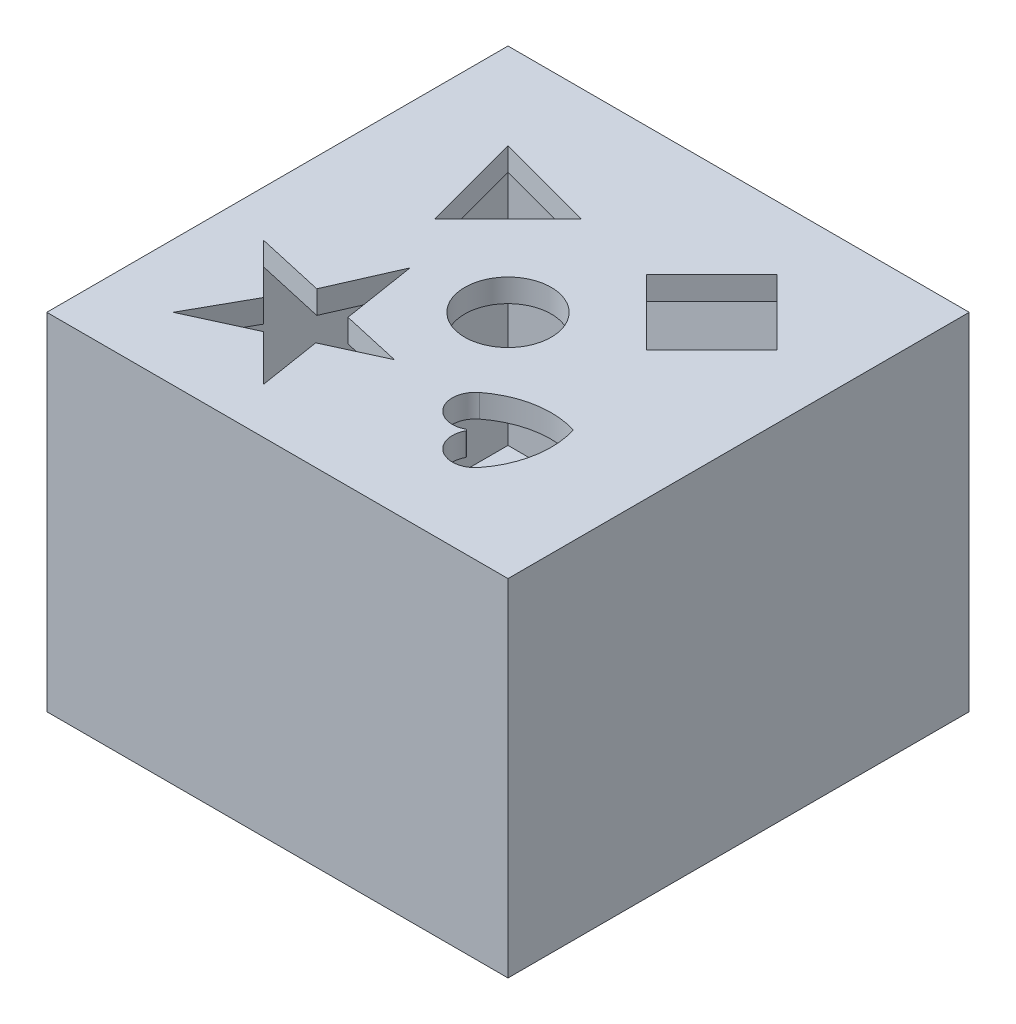
ISO-10303-21;
HEADER;
FILE_DESCRIPTION(('STEP AP214'),'2;1');
FILE_NAME('part.step','',(''),(''),'','','');
FILE_SCHEMA(('AUTOMOTIVE_DESIGN { 1 0 10303 214 1 1 1 1 }'));
ENDSEC;
DATA;
#1=APPLICATION_CONTEXT('core data for automotive mechanical design processes');
#2=APPLICATION_PROTOCOL_DEFINITION('international standard','automotive_design',2000,#1);
#3=PRODUCT_CONTEXT('',#1,'mechanical');
#4=PRODUCT('Part','Part','',(#3));
#5=PRODUCT_RELATED_PRODUCT_CATEGORY('part','',(#4));
#6=PRODUCT_DEFINITION_FORMATION('','',#4);
#7=PRODUCT_DEFINITION_CONTEXT('part definition',#1,'design');
#8=PRODUCT_DEFINITION('design','',#6,#7);
#9=PRODUCT_DEFINITION_SHAPE('','',#8);
#10=(LENGTH_UNIT() NAMED_UNIT(*) SI_UNIT(.MILLI.,.METRE.));
#11=(NAMED_UNIT(*) PLANE_ANGLE_UNIT() SI_UNIT($,.RADIAN.));
#12=(NAMED_UNIT(*) SI_UNIT($,.STERADIAN.) SOLID_ANGLE_UNIT());
#13=UNCERTAINTY_MEASURE_WITH_UNIT(LENGTH_MEASURE(1.E-05),#10,'distance_accuracy_value','');
#14=(GEOMETRIC_REPRESENTATION_CONTEXT(3) GLOBAL_UNCERTAINTY_ASSIGNED_CONTEXT((#13)) GLOBAL_UNIT_ASSIGNED_CONTEXT((#10,
#11,#12)) REPRESENTATION_CONTEXT('',''));
#15=CARTESIAN_POINT('',(0.,0.,0.));
#16=DIRECTION('',(0.,0.,1.));
#17=DIRECTION('',(1.,0.,0.));
#18=AXIS2_PLACEMENT_3D('',#15,#16,#17);
#19=CARTESIAN_POINT('',(20.,15.,-20.));
#20=DIRECTION('',(-1.,0.,0.));
#21=DIRECTION('',(0.,0.,1.));
#22=AXIS2_PLACEMENT_3D('',#19,#20,#21);
#23=PLANE('',#22);
#24=DIRECTION('',(0.,0.,-1.));
#25=VECTOR('',#24,1.);
#26=CARTESIAN_POINT('',(20.,-15.,-20.));
#27=LINE('',#26,#25);
#28=CARTESIAN_POINT('',(20.,-15.,20.));
#29=VERTEX_POINT('',#28);
#30=CARTESIAN_POINT('',(20.,-15.,-20.));
#31=VERTEX_POINT('',#30);
#32=EDGE_CURVE('E437',#29,#31,#27,.T.);
#33=ORIENTED_EDGE('',*,*,#32,.T.);
#34=DIRECTION('',(0.,-1.,0.));
#35=VECTOR('',#34,1.);
#36=CARTESIAN_POINT('',(20.,15.,-20.));
#37=LINE('',#36,#35);
#38=CARTESIAN_POINT('',(20.,15.,-20.));
#39=VERTEX_POINT('',#38);
#40=EDGE_CURVE('E469',#39,#31,#37,.T.);
#41=ORIENTED_EDGE('',*,*,#40,.F.);
#42=DIRECTION('',(0.,0.,-1.));
#43=VECTOR('',#42,1.);
#44=CARTESIAN_POINT('',(20.,15.,-20.));
#45=LINE('',#44,#43);
#46=CARTESIAN_POINT('',(20.,15.,20.));
#47=VERTEX_POINT('',#46);
#48=EDGE_CURVE('E443',#47,#39,#45,.T.);
#49=ORIENTED_EDGE('',*,*,#48,.F.);
#50=DIRECTION('',(0.,-1.,0.));
#51=VECTOR('',#50,1.);
#52=CARTESIAN_POINT('',(20.,15.,20.));
#53=LINE('',#52,#51);
#54=EDGE_CURVE('E453',#47,#29,#53,.T.);
#55=ORIENTED_EDGE('',*,*,#54,.T.);
#56=EDGE_LOOP('',(#33,#41,#49,#55));
#57=FACE_BOUND('',#56,.T.);
#58=ADVANCED_FACE('F33',(#57),#23,.F.);
#59=CARTESIAN_POINT('',(-20.,15.,-20.));
#60=DIRECTION('',(0.,0.,1.));
#61=DIRECTION('',(1.,0.,0.));
#62=AXIS2_PLACEMENT_3D('',#59,#60,#61);
#63=PLANE('',#62);
#64=DIRECTION('',(-1.,0.,0.));
#65=VECTOR('',#64,1.);
#66=CARTESIAN_POINT('',(-20.,-15.,-20.));
#67=LINE('',#66,#65);
#68=CARTESIAN_POINT('',(-20.,-15.,-20.));
#69=VERTEX_POINT('',#68);
#70=EDGE_CURVE('E456',#31,#69,#67,.T.);
#71=ORIENTED_EDGE('',*,*,#70,.T.);
#72=DIRECTION('',(0.,-1.,0.));
#73=VECTOR('',#72,1.);
#74=CARTESIAN_POINT('',(-20.,15.,-20.));
#75=LINE('',#74,#73);
#76=CARTESIAN_POINT('',(-20.,15.,-20.));
#77=VERTEX_POINT('',#76);
#78=EDGE_CURVE('E466',#77,#69,#75,.T.);
#79=ORIENTED_EDGE('',*,*,#78,.F.);
#80=DIRECTION('',(-1.,0.,0.));
#81=VECTOR('',#80,1.);
#82=CARTESIAN_POINT('',(-20.,15.,-20.));
#83=LINE('',#82,#81);
#84=EDGE_CURVE('E446',#39,#77,#83,.T.);
#85=ORIENTED_EDGE('',*,*,#84,.F.);
#86=ORIENTED_EDGE('',*,*,#40,.T.);
#87=EDGE_LOOP('',(#71,#79,#85,#86));
#88=FACE_BOUND('',#87,.T.);
#89=ADVANCED_FACE('F500',(#88),#63,.F.);
#90=CARTESIAN_POINT('',(-20.,15.,-20.));
#91=DIRECTION('',(1.,0.,0.));
#92=DIRECTION('',(0.,0.,-1.));
#93=AXIS2_PLACEMENT_3D('',#90,#91,#92);
#94=PLANE('',#93);
#95=DIRECTION('',(0.,0.,1.));
#96=VECTOR('',#95,1.);
#97=CARTESIAN_POINT('',(-20.,-15.,-20.));
#98=LINE('',#97,#96);
#99=CARTESIAN_POINT('',(-20.,-15.,20.));
#100=VERTEX_POINT('',#99);
#101=EDGE_CURVE('E458',#69,#100,#98,.T.);
#102=ORIENTED_EDGE('',*,*,#101,.T.);
#103=DIRECTION('',(0.,-1.,0.));
#104=VECTOR('',#103,1.);
#105=CARTESIAN_POINT('',(-20.,15.,20.));
#106=LINE('',#105,#104);
#107=CARTESIAN_POINT('',(-20.,15.,20.));
#108=VERTEX_POINT('',#107);
#109=EDGE_CURVE('E463',#108,#100,#106,.T.);
#110=ORIENTED_EDGE('',*,*,#109,.F.);
#111=DIRECTION('',(0.,0.,1.));
#112=VECTOR('',#111,1.);
#113=CARTESIAN_POINT('',(-20.,15.,-20.));
#114=LINE('',#113,#112);
#115=EDGE_CURVE('E449',#77,#108,#114,.T.);
#116=ORIENTED_EDGE('',*,*,#115,.F.);
#117=ORIENTED_EDGE('',*,*,#78,.T.);
#118=EDGE_LOOP('',(#102,#110,#116,#117));
#119=FACE_BOUND('',#118,.T.);
#120=ADVANCED_FACE('F505',(#119),#94,.F.);
#121=CARTESIAN_POINT('',(-20.,15.,20.));
#122=DIRECTION('',(0.,0.,-1.));
#123=DIRECTION('',(-1.,0.,0.));
#124=AXIS2_PLACEMENT_3D('',#121,#122,#123);
#125=PLANE('',#124);
#126=DIRECTION('',(1.,0.,0.));
#127=VECTOR('',#126,1.);
#128=CARTESIAN_POINT('',(-20.,-15.,20.));
#129=LINE('',#128,#127);
#130=EDGE_CURVE('E447',#100,#29,#129,.T.);
#131=ORIENTED_EDGE('',*,*,#130,.T.);
#132=ORIENTED_EDGE('',*,*,#54,.F.);
#133=DIRECTION('',(1.,0.,0.));
#134=VECTOR('',#133,1.);
#135=CARTESIAN_POINT('',(-20.,15.,20.));
#136=LINE('',#135,#134);
#137=EDGE_CURVE('E451',#108,#47,#136,.T.);
#138=ORIENTED_EDGE('',*,*,#137,.F.);
#139=ORIENTED_EDGE('',*,*,#109,.T.);
#140=EDGE_LOOP('',(#131,#132,#138,#139));
#141=FACE_BOUND('',#140,.T.);
#142=ADVANCED_FACE('F511',(#141),#125,.F.);
#143=CARTESIAN_POINT('',(0.,15.,0.));
#144=DIRECTION('',(0.,1.,0.));
#145=DIRECTION('',(0.,0.,1.));
#146=AXIS2_PLACEMENT_3D('',#143,#144,#145);
#147=PLANE('',#146);
#148=CARTESIAN_POINT('',(8.83883476483185,15.,11.667261889578));
#149=DIRECTION('',(0.,1.,0.));
#150=DIRECTION('',(0.,0.,1.));
#151=AXIS2_PLACEMENT_3D('',#148,#149,#150);
#152=CIRCLE('',#151,2.);
#153=CARTESIAN_POINT('',(7.06075588932713,15.,10.7516006462769));
#154=VERTEX_POINT('',#153);
#155=CARTESIAN_POINT('',(10.4111034100799,15.,12.9033732547753));
#156=VERTEX_POINT('',#155);
#157=EDGE_CURVE('E395',#154,#156,#152,.T.);
#158=ORIENTED_EDGE('',*,*,#157,.F.);
#159=CARTESIAN_POINT('',(6.97185194555189,15.,10.7058175841118));
#160=DIRECTION('',(0.,1.,0.));
#161=DIRECTION('',(0.,0.,1.));
#162=AXIS2_PLACEMENT_3D('',#159,#160,#161);
#163=CIRCLE('',#162,0.1);
#164=CARTESIAN_POINT('',(6.92606888338683,15.,10.6169136403366));
#165=VERTEX_POINT('',#164);
#166=EDGE_CURVE('E55',#154,#165,#163,.T.);
#167=ORIENTED_EDGE('',*,*,#166,.T.);
#168=CARTESIAN_POINT('',(6.01040764008565,15.,8.83883476483185));
#169=DIRECTION('',(0.,1.,0.));
#170=DIRECTION('',(0.,0.,1.));
#171=AXIS2_PLACEMENT_3D('',#168,#169,#170);
#172=CIRCLE('',#171,2.);
#173=CARTESIAN_POINT('',(4.77429627488837,15.,7.2665661195838));
#174=VERTEX_POINT('',#173);
#175=EDGE_CURVE('E393',#174,#165,#172,.T.);
#176=ORIENTED_EDGE('',*,*,#175,.F.);
#177=CARTESIAN_POINT('',(9.40971389437817,15.,13.162573539264));
#178=DIRECTION('',(0.,1.,0.));
#179=DIRECTION('',(0.,0.,-1.));
#180=AXIS2_PLACEMENT_3D('',#177,#178,#179);
#181=CIRCLE('',#180,7.50000000000002);
#182=CARTESIAN_POINT('',(11.667261889578,15.,6.01040764008563));
#183=VERTEX_POINT('',#182);
#184=EDGE_CURVE('E391',#183,#174,#181,.T.);
#185=ORIENTED_EDGE('',*,*,#184,.F.);
#186=CARTESIAN_POINT('',(4.51509599039972,15.,8.26795563528551));
#187=DIRECTION('',(0.,1.,0.));
#188=DIRECTION('',(0.,0.,1.));
#189=AXIS2_PLACEMENT_3D('',#186,#187,#188);
#190=CIRCLE('',#189,7.49999999999999);
#191=EDGE_CURVE('E383',#156,#183,#190,.T.);
#192=ORIENTED_EDGE('',*,*,#191,.F.);
#193=EDGE_LOOP('',(#158,#167,#176,#185,#192));
#194=FACE_BOUND('',#193,.T.);
#195=DIRECTION('',(-0.402746029819922,0.,0.915311769543192));
#196=VECTOR('',#195,1.);
#197=CARTESIAN_POINT('',(-10.0568797876879,15.,6.52797896050916));
#198=LINE('',#197,#196);
#199=CARTESIAN_POINT('',(-7.58197115154362,15.,0.903310222694767));
#200=VERTEX_POINT('',#199);
#201=CARTESIAN_POINT('',(-10.0568797876879,15.,6.52797896050916));
#202=VERTEX_POINT('',#201);
#203=EDGE_CURVE('E331',#200,#202,#198,.T.);
#204=ORIENTED_EDGE('',*,*,#203,.F.);
#205=DIRECTION('',(-0.156434465040204,0.,-0.987688340595142));
#206=VECTOR('',#205,1.);
#207=CARTESIAN_POINT('',(-7.58197115154362,15.,0.903310222694767));
#208=LINE('',#207,#206);
#209=CARTESIAN_POINT('',(-6.56672994665904,15.,7.31329091779646));
#210=VERTEX_POINT('',#209);
#211=EDGE_CURVE('E303',#210,#200,#208,.T.);
#212=ORIENTED_EDGE('',*,*,#211,.F.);
#213=DIRECTION('',(-0.975608065324912,0.,-0.219519709531931));
#214=VECTOR('',#213,1.);
#215=CARTESIAN_POINT('',(-6.56672994665904,15.,7.31329091779646));
#216=LINE('',#215,#214);
#217=CARTESIAN_POINT('',(-1.36300417246353,15.,8.48417132667744));
#218=VERTEX_POINT('',#217);
#219=EDGE_CURVE('E355',#218,#210,#216,.T.);
#220=ORIENTED_EDGE('',*,*,#219,.F.);
#221=DIRECTION('',(0.908919225140274,0.,-0.416972231893689));
#222=VECTOR('',#221,1.);
#223=CARTESIAN_POINT('',(-1.36300417246353,15.,8.48417132667744));
#224=LINE('',#223,#222);
#225=CARTESIAN_POINT('',(-6.04135271318949,15.,10.6303922213912));
#226=VERTEX_POINT('',#225);
#227=EDGE_CURVE('E352',#226,#218,#224,.T.);
#228=ORIENTED_EDGE('',*,*,#227,.F.);
#229=DIRECTION('',(-0.156434465040204,0.,-0.987688340595142));
#230=VECTOR('',#229,1.);
#231=CARTESIAN_POINT('',(-6.04135271318949,15.,10.6303922213912));
#232=LINE('',#231,#230);
#233=CARTESIAN_POINT('',(-5.19127449252038,15.,15.9975748747341));
#234=VERTEX_POINT('',#233);
#235=EDGE_CURVE('E349',#234,#226,#232,.T.);
#236=ORIENTED_EDGE('',*,*,#235,.F.);
#237=DIRECTION('',(0.707106781186528,0.,0.707106781186568));
#238=VECTOR('',#237,1.);
#239=CARTESIAN_POINT('',(-5.19127449252038,15.,15.9975748747341));
#240=LINE('',#239,#238);
#241=CARTESIAN_POINT('',(-9.13789808954164,15.,12.0509512777126));
#242=VERTEX_POINT('',#241);
#243=EDGE_CURVE('E346',#242,#234,#240,.T.);
#244=ORIENTED_EDGE('',*,*,#243,.F.);
#245=DIRECTION('',(0.908919225140274,0.,-0.416972231893689));
#246=VECTOR('',#245,1.);
#247=CARTESIAN_POINT('',(-9.13789808954164,15.,12.0509512777126));
#248=LINE('',#247,#246);
#249=CARTESIAN_POINT('',(-14.5200430826667,15.,14.5200430826664));
#250=VERTEX_POINT('',#249);
#251=EDGE_CURVE('E343',#250,#242,#248,.T.);
#252=ORIENTED_EDGE('',*,*,#251,.F.);
#253=DIRECTION('',(-0.487572413890718,0.,0.873082551201648));
#254=VECTOR('',#253,1.);
#255=CARTESIAN_POINT('',(-14.5200430826667,15.,14.5200430826664));
#256=LINE('',#255,#254);
#257=CARTESIAN_POINT('',(-11.7066579292842,15.,9.48219143796986));
#258=VERTEX_POINT('',#257);
#259=EDGE_CURVE('E340',#258,#250,#256,.T.);
#260=ORIENTED_EDGE('',*,*,#259,.F.);
#261=DIRECTION('',(0.707106781186529,0.,0.707106781186566));
#262=VECTOR('',#261,1.);
#263=CARTESIAN_POINT('',(-11.7066579292842,15.,9.48219143796986));
#264=LINE('',#263,#262);
#265=CARTESIAN_POINT('',(-15.9975748747339,15.,5.19127449251998));
#266=VERTEX_POINT('',#265);
#267=EDGE_CURVE('E337',#266,#258,#264,.T.);
#268=ORIENTED_EDGE('',*,*,#267,.F.);
#269=DIRECTION('',(-0.975608065324911,0.,-0.219519709531931));
#270=VECTOR('',#269,1.);
#271=CARTESIAN_POINT('',(-15.9975748747339,15.,5.19127449251998));
#272=LINE('',#271,#270);
#273=EDGE_CURVE('E333',#202,#266,#272,.T.);
#274=ORIENTED_EDGE('',*,*,#273,.F.);
#275=EDGE_LOOP('',(#204,#212,#220,#228,#236,#244,#252,#260,#268,#274));
#276=FACE_BOUND('',#275,.T.);
#277=DIRECTION('',(-0.965925826289065,0.,-0.258819045102533));
#278=VECTOR('',#277,1.);
#279=CARTESIAN_POINT('',(-3.81973694240498,15.,-10.1836979730839));
#280=LINE('',#279,#278);
#281=CARTESIAN_POINT('',(-3.81973694240498,15.,-10.1836979730839));
#282=VERTEX_POINT('',#281);
#283=CARTESIAN_POINT('',(-12.5130693790066,15.,-12.5130693790066));
#284=VERTEX_POINT('',#283);
#285=EDGE_CURVE('E286',#282,#284,#280,.T.);
#286=ORIENTED_EDGE('',*,*,#285,.F.);
#287=DIRECTION('',(0.707106781186557,0.,-0.707106781186539));
#288=VECTOR('',#287,1.);
#289=CARTESIAN_POINT('',(-10.183697973084,15.,-3.819736942405));
#290=LINE('',#289,#288);
#291=CARTESIAN_POINT('',(-10.183697973084,15.,-3.819736942405));
#292=VERTEX_POINT('',#291);
#293=EDGE_CURVE('E279',#292,#282,#290,.T.);
#294=ORIENTED_EDGE('',*,*,#293,.F.);
#295=DIRECTION('',(0.258819045102508,0.,0.965925826289072));
#296=VECTOR('',#295,1.);
#297=CARTESIAN_POINT('',(-12.5130693790066,15.,-12.5130693790066));
#298=LINE('',#297,#296);
#299=EDGE_CURVE('E288',#284,#292,#298,.T.);
#300=ORIENTED_EDGE('',*,*,#299,.F.);
#301=EDGE_LOOP('',(#286,#294,#300));
#302=FACE_BOUND('',#301,.T.);
#303=DIRECTION('',(0.707106781186547,0.,-0.707106781186548));
#304=VECTOR('',#303,1.);
#305=CARTESIAN_POINT('',(8.83883476483184,15.,-3.18198051533946));
#306=LINE('',#305,#304);
#307=CARTESIAN_POINT('',(8.83883476483184,15.,-3.18198051533946));
#308=VERTEX_POINT('',#307);
#309=CARTESIAN_POINT('',(14.4956890143242,15.,-8.83883476483184));
#310=VERTEX_POINT('',#309);
#311=EDGE_CURVE('E237',#308,#310,#306,.T.);
#312=ORIENTED_EDGE('',*,*,#311,.F.);
#313=DIRECTION('',(0.707106781186548,0.,0.707106781186548));
#314=VECTOR('',#313,1.);
#315=CARTESIAN_POINT('',(3.18198051533946,15.,-8.83883476483184));
#316=LINE('',#315,#314);
#317=CARTESIAN_POINT('',(3.18198051533946,15.,-8.83883476483184));
#318=VERTEX_POINT('',#317);
#319=EDGE_CURVE('E255',#318,#308,#316,.T.);
#320=ORIENTED_EDGE('',*,*,#319,.F.);
#321=DIRECTION('',(-0.707106781186547,0.,0.707106781186548));
#322=VECTOR('',#321,1.);
#323=CARTESIAN_POINT('',(8.83883476483184,15.,-14.4956890143242));
#324=LINE('',#323,#322);
#325=CARTESIAN_POINT('',(8.83883476483184,15.,-14.4956890143242));
#326=VERTEX_POINT('',#325);
#327=EDGE_CURVE('E258',#326,#318,#324,.T.);
#328=ORIENTED_EDGE('',*,*,#327,.F.);
#329=DIRECTION('',(-0.707106781186548,0.,-0.707106781186547));
#330=VECTOR('',#329,1.);
#331=CARTESIAN_POINT('',(14.4956890143242,15.,-8.83883476483184));
#332=LINE('',#331,#330);
#333=EDGE_CURVE('E264',#310,#326,#332,.T.);
#334=ORIENTED_EDGE('',*,*,#333,.F.);
#335=EDGE_LOOP('',(#312,#320,#328,#334));
#336=FACE_BOUND('',#335,.T.);
#337=CARTESIAN_POINT('',(0.,15.,0.));
#338=DIRECTION('',(0.,1.,0.));
#339=DIRECTION('',(0.,0.,1.));
#340=AXIS2_PLACEMENT_3D('',#337,#338,#339);
#341=CIRCLE('',#340,3.75);
#342=CARTESIAN_POINT('',(0.,15.,3.75));
#343=VERTEX_POINT('',#342);
#344=EDGE_CURVE('E271',#343,#343,#341,.T.);
#345=ORIENTED_EDGE('',*,*,#344,.F.);
#346=EDGE_LOOP('',(#345));
#347=FACE_BOUND('',#346,.T.);
#348=ORIENTED_EDGE('',*,*,#48,.T.);
#349=ORIENTED_EDGE('',*,*,#84,.T.);
#350=ORIENTED_EDGE('',*,*,#115,.T.);
#351=ORIENTED_EDGE('',*,*,#137,.T.);
#352=EDGE_LOOP('',(#348,#349,#350,#351));
#353=FACE_BOUND('',#352,.T.);
#354=ADVANCED_FACE('F483',(#194,#276,#302,#336,#347,#353),#147,.T.);
#355=CARTESIAN_POINT('',(0.,-15.,0.));
#356=DIRECTION('',(0.,1.,0.));
#357=DIRECTION('',(0.,0.,1.));
#358=AXIS2_PLACEMENT_3D('',#355,#356,#357);
#359=PLANE('',#358);
#360=ORIENTED_EDGE('',*,*,#32,.F.);
#361=ORIENTED_EDGE('',*,*,#130,.F.);
#362=ORIENTED_EDGE('',*,*,#101,.F.);
#363=ORIENTED_EDGE('',*,*,#70,.F.);
#364=EDGE_LOOP('',(#360,#361,#362,#363));
#365=FACE_BOUND('',#364,.T.);
#366=ADVANCED_FACE('F516',(#365),#359,.F.);
#367=CARTESIAN_POINT('',(8.83883476483184,13.,-3.18198051533946));
#368=DIRECTION('',(0.707106781186548,0.,0.707106781186547));
#369=DIRECTION('',(0.707106781186547,0.,-0.707106781186548));
#370=AXIS2_PLACEMENT_3D('',#367,#368,#369);
#371=PLANE('',#370);
#372=ORIENTED_EDGE('',*,*,#311,.T.);
#373=DIRECTION('',(0.,1.,0.));
#374=VECTOR('',#373,1.);
#375=CARTESIAN_POINT('',(14.4956890143242,13.,-8.83883476483184));
#376=LINE('',#375,#374);
#377=CARTESIAN_POINT('',(14.4956890143242,13.,-8.83883476483184));
#378=VERTEX_POINT('',#377);
#379=EDGE_CURVE('E230',#378,#310,#376,.T.);
#380=ORIENTED_EDGE('',*,*,#379,.F.);
#381=DIRECTION('',(0.707106781186547,0.,-0.707106781186548));
#382=VECTOR('',#381,1.);
#383=CARTESIAN_POINT('',(8.83883476483184,13.,-3.18198051533946));
#384=LINE('',#383,#382);
#385=CARTESIAN_POINT('',(8.83883476483184,13.,-3.18198051533946));
#386=VERTEX_POINT('',#385);
#387=EDGE_CURVE('E234',#386,#378,#384,.T.);
#388=ORIENTED_EDGE('',*,*,#387,.F.);
#389=DIRECTION('',(0.,1.,0.));
#390=VECTOR('',#389,1.);
#391=CARTESIAN_POINT('',(8.83883476483184,13.,-3.18198051533946));
#392=LINE('',#391,#390);
#393=EDGE_CURVE('E269',#386,#308,#392,.T.);
#394=ORIENTED_EDGE('',*,*,#393,.T.);
#395=EDGE_LOOP('',(#372,#380,#388,#394));
#396=FACE_BOUND('',#395,.T.);
#397=ADVANCED_FACE('F232',(#396),#371,.F.);
#398=CARTESIAN_POINT('',(3.18198051533946,13.,-8.83883476483184));
#399=DIRECTION('',(-0.707106781186548,0.,0.707106781186547));
#400=DIRECTION('',(0.707106781186547,0.,0.707106781186548));
#401=AXIS2_PLACEMENT_3D('',#398,#399,#400);
#402=PLANE('',#401);
#403=ORIENTED_EDGE('',*,*,#319,.T.);
#404=ORIENTED_EDGE('',*,*,#393,.F.);
#405=DIRECTION('',(0.707106781186548,0.,0.707106781186548));
#406=VECTOR('',#405,1.);
#407=CARTESIAN_POINT('',(3.18198051533946,13.,-8.83883476483184));
#408=LINE('',#407,#406);
#409=CARTESIAN_POINT('',(3.18198051533946,13.,-8.83883476483184));
#410=VERTEX_POINT('',#409);
#411=EDGE_CURVE('E242',#410,#386,#408,.T.);
#412=ORIENTED_EDGE('',*,*,#411,.F.);
#413=DIRECTION('',(0.,1.,0.));
#414=VECTOR('',#413,1.);
#415=CARTESIAN_POINT('',(3.18198051533946,13.,-8.83883476483184));
#416=LINE('',#415,#414);
#417=EDGE_CURVE('E272',#410,#318,#416,.T.);
#418=ORIENTED_EDGE('',*,*,#417,.T.);
#419=EDGE_LOOP('',(#403,#404,#412,#418));
#420=FACE_BOUND('',#419,.T.);
#421=ADVANCED_FACE('F610',(#420),#402,.F.);
#422=CARTESIAN_POINT('',(8.83883476483184,13.,-14.4956890143242));
#423=DIRECTION('',(-0.707106781186548,0.,-0.707106781186547));
#424=DIRECTION('',(-0.707106781186547,0.,0.707106781186548));
#425=AXIS2_PLACEMENT_3D('',#422,#423,#424);
#426=PLANE('',#425);
#427=ORIENTED_EDGE('',*,*,#327,.T.);
#428=ORIENTED_EDGE('',*,*,#417,.F.);
#429=DIRECTION('',(-0.707106781186547,0.,0.707106781186548));
#430=VECTOR('',#429,1.);
#431=CARTESIAN_POINT('',(8.83883476483184,13.,-14.4956890143242));
#432=LINE('',#431,#430);
#433=CARTESIAN_POINT('',(8.83883476483184,13.,-14.4956890143242));
#434=VERTEX_POINT('',#433);
#435=EDGE_CURVE('E250',#434,#410,#432,.T.);
#436=ORIENTED_EDGE('',*,*,#435,.F.);
#437=DIRECTION('',(0.,1.,0.));
#438=VECTOR('',#437,1.);
#439=CARTESIAN_POINT('',(8.83883476483184,13.,-14.4956890143242));
#440=LINE('',#439,#438);
#441=EDGE_CURVE('E241',#434,#326,#440,.T.);
#442=ORIENTED_EDGE('',*,*,#441,.T.);
#443=EDGE_LOOP('',(#427,#428,#436,#442));
#444=FACE_BOUND('',#443,.T.);
#445=ADVANCED_FACE('F613',(#444),#426,.F.);
#446=CARTESIAN_POINT('',(14.4956890143242,13.,-8.83883476483184));
#447=DIRECTION('',(0.707106781186547,0.,-0.707106781186548));
#448=DIRECTION('',(-0.707106781186548,0.,-0.707106781186547));
#449=AXIS2_PLACEMENT_3D('',#446,#447,#448);
#450=PLANE('',#449);
#451=ORIENTED_EDGE('',*,*,#333,.T.);
#452=ORIENTED_EDGE('',*,*,#441,.F.);
#453=DIRECTION('',(-0.707106781186548,0.,-0.707106781186547));
#454=VECTOR('',#453,1.);
#455=CARTESIAN_POINT('',(14.4956890143242,13.,-8.83883476483184));
#456=LINE('',#455,#454);
#457=EDGE_CURVE('E246',#378,#434,#456,.T.);
#458=ORIENTED_EDGE('',*,*,#457,.F.);
#459=ORIENTED_EDGE('',*,*,#379,.T.);
#460=EDGE_LOOP('',(#451,#452,#458,#459));
#461=FACE_BOUND('',#460,.T.);
#462=ADVANCED_FACE('F247',(#461),#450,.F.);
#463=CARTESIAN_POINT('',(-3.81973694240498,13.,-10.1836979730839));
#464=DIRECTION('',(0.258819045102533,0.,-0.965925826289065));
#465=DIRECTION('',(-0.965925826289065,0.,-0.258819045102533));
#466=AXIS2_PLACEMENT_3D('',#463,#464,#465);
#467=PLANE('',#466);
#468=ORIENTED_EDGE('',*,*,#285,.T.);
#469=DIRECTION('',(0.,1.,0.));
#470=VECTOR('',#469,1.);
#471=CARTESIAN_POINT('',(-12.5130693790066,13.,-12.5130693790066));
#472=LINE('',#471,#470);
#473=CARTESIAN_POINT('',(-12.5130693790066,13.,-12.5130693790066));
#474=VERTEX_POINT('',#473);
#475=EDGE_CURVE('E285',#474,#284,#472,.T.);
#476=ORIENTED_EDGE('',*,*,#475,.F.);
#477=DIRECTION('',(-0.965925826289065,0.,-0.258819045102533));
#478=VECTOR('',#477,1.);
#479=CARTESIAN_POINT('',(-3.81973694240498,13.,-10.1836979730839));
#480=LINE('',#479,#478);
#481=CARTESIAN_POINT('',(-3.81973694240498,13.,-10.1836979730839));
#482=VERTEX_POINT('',#481);
#483=EDGE_CURVE('E275',#482,#474,#480,.T.);
#484=ORIENTED_EDGE('',*,*,#483,.F.);
#485=DIRECTION('',(0.,1.,0.));
#486=VECTOR('',#485,1.);
#487=CARTESIAN_POINT('',(-3.81973694240498,13.,-10.1836979730839));
#488=LINE('',#487,#486);
#489=EDGE_CURVE('E265',#482,#282,#488,.T.);
#490=ORIENTED_EDGE('',*,*,#489,.T.);
#491=EDGE_LOOP('',(#468,#476,#484,#490));
#492=FACE_BOUND('',#491,.T.);
#493=ADVANCED_FACE('F597',(#492),#467,.F.);
#494=CARTESIAN_POINT('',(-10.183697973084,13.,-3.819736942405));
#495=DIRECTION('',(0.707106781186539,0.,0.707106781186557));
#496=DIRECTION('',(0.707106781186557,0.,-0.707106781186539));
#497=AXIS2_PLACEMENT_3D('',#494,#495,#496);
#498=PLANE('',#497);
#499=ORIENTED_EDGE('',*,*,#293,.T.);
#500=ORIENTED_EDGE('',*,*,#489,.F.);
#501=DIRECTION('',(0.707106781186557,0.,-0.707106781186539));
#502=VECTOR('',#501,1.);
#503=CARTESIAN_POINT('',(-10.183697973084,13.,-3.819736942405));
#504=LINE('',#503,#502);
#505=CARTESIAN_POINT('',(-10.183697973084,13.,-3.81973694240501));
#506=VERTEX_POINT('',#505);
#507=EDGE_CURVE('E282',#506,#482,#504,.T.);
#508=ORIENTED_EDGE('',*,*,#507,.F.);
#509=DIRECTION('',(0.,1.,0.));
#510=VECTOR('',#509,1.);
#511=CARTESIAN_POINT('',(-10.183697973084,13.,-3.819736942405));
#512=LINE('',#511,#510);
#513=EDGE_CURVE('E295',#506,#292,#512,.T.);
#514=ORIENTED_EDGE('',*,*,#513,.T.);
#515=EDGE_LOOP('',(#499,#500,#508,#514));
#516=FACE_BOUND('',#515,.T.);
#517=ADVANCED_FACE('F600',(#516),#498,.F.);
#518=CARTESIAN_POINT('',(-12.5130693790066,13.,-12.5130693790066));
#519=DIRECTION('',(-0.965925826289072,0.,0.258819045102508));
#520=DIRECTION('',(0.258819045102508,0.,0.965925826289072));
#521=AXIS2_PLACEMENT_3D('',#518,#519,#520);
#522=PLANE('',#521);
#523=ORIENTED_EDGE('',*,*,#299,.T.);
#524=ORIENTED_EDGE('',*,*,#513,.F.);
#525=DIRECTION('',(0.258819045102508,0.,0.965925826289072));
#526=VECTOR('',#525,1.);
#527=CARTESIAN_POINT('',(-12.5130693790066,13.,-12.5130693790066));
#528=LINE('',#527,#526);
#529=EDGE_CURVE('E278',#474,#506,#528,.T.);
#530=ORIENTED_EDGE('',*,*,#529,.F.);
#531=ORIENTED_EDGE('',*,*,#475,.T.);
#532=EDGE_LOOP('',(#523,#524,#530,#531));
#533=FACE_BOUND('',#532,.T.);
#534=ADVANCED_FACE('F561',(#533),#522,.F.);
#535=CARTESIAN_POINT('',(-10.0568797876879,13.,6.52797896050916));
#536=DIRECTION('',(-0.915311769543192,0.,-0.402746029819923));
#537=DIRECTION('',(-0.402746029819922,0.,0.915311769543192));
#538=AXIS2_PLACEMENT_3D('',#535,#536,#537);
#539=PLANE('',#538);
#540=ORIENTED_EDGE('',*,*,#203,.T.);
#541=DIRECTION('',(0.,1.,0.));
#542=VECTOR('',#541,1.);
#543=CARTESIAN_POINT('',(-10.0568797876879,13.,6.52797896050916));
#544=LINE('',#543,#542);
#545=CARTESIAN_POINT('',(-10.0568797876879,13.,6.52797896050916));
#546=VERTEX_POINT('',#545);
#547=EDGE_CURVE('E330',#546,#202,#544,.T.);
#548=ORIENTED_EDGE('',*,*,#547,.F.);
#549=DIRECTION('',(-0.402746029819922,0.,0.915311769543192));
#550=VECTOR('',#549,1.);
#551=CARTESIAN_POINT('',(-10.0568797876879,13.,6.52797896050916));
#552=LINE('',#551,#550);
#553=CARTESIAN_POINT('',(-7.58197115154362,13.,0.903310222694767));
#554=VERTEX_POINT('',#553);
#555=EDGE_CURVE('E299',#554,#546,#552,.T.);
#556=ORIENTED_EDGE('',*,*,#555,.F.);
#557=DIRECTION('',(0.,1.,0.));
#558=VECTOR('',#557,1.);
#559=CARTESIAN_POINT('',(-7.58197115154362,13.,0.903310222694767));
#560=LINE('',#559,#558);
#561=EDGE_CURVE('E289',#554,#200,#560,.T.);
#562=ORIENTED_EDGE('',*,*,#561,.T.);
#563=EDGE_LOOP('',(#540,#548,#556,#562));
#564=FACE_BOUND('',#563,.T.);
#565=ADVANCED_FACE('F557',(#564),#539,.F.);
#566=CARTESIAN_POINT('',(-7.58197115154362,13.,0.903310222694767));
#567=DIRECTION('',(0.987688340595142,0.,-0.156434465040204));
#568=DIRECTION('',(-0.156434465040204,0.,-0.987688340595142));
#569=AXIS2_PLACEMENT_3D('',#566,#567,#568);
#570=PLANE('',#569);
#571=ORIENTED_EDGE('',*,*,#211,.T.);
#572=ORIENTED_EDGE('',*,*,#561,.F.);
#573=DIRECTION('',(-0.156434465040204,0.,-0.987688340595142));
#574=VECTOR('',#573,1.);
#575=CARTESIAN_POINT('',(-7.58197115154362,13.,0.903310222694767));
#576=LINE('',#575,#574);
#577=CARTESIAN_POINT('',(-6.56672994665904,13.,7.31329091779646));
#578=VERTEX_POINT('',#577);
#579=EDGE_CURVE('E327',#578,#554,#576,.T.);
#580=ORIENTED_EDGE('',*,*,#579,.F.);
#581=DIRECTION('',(0.,1.,0.));
#582=VECTOR('',#581,1.);
#583=CARTESIAN_POINT('',(-6.56672994665904,13.,7.31329091779646));
#584=LINE('',#583,#582);
#585=EDGE_CURVE('E361',#578,#210,#584,.T.);
#586=ORIENTED_EDGE('',*,*,#585,.T.);
#587=EDGE_LOOP('',(#571,#572,#580,#586));
#588=FACE_BOUND('',#587,.T.);
#589=ADVANCED_FACE('F560',(#588),#570,.F.);
#590=CARTESIAN_POINT('',(-6.56672994665904,13.,7.31329091779646));
#591=DIRECTION('',(0.219519709531931,0.,-0.975608065324912));
#592=DIRECTION('',(-0.975608065324912,0.,-0.219519709531931));
#593=AXIS2_PLACEMENT_3D('',#590,#591,#592);
#594=PLANE('',#593);
#595=ORIENTED_EDGE('',*,*,#219,.T.);
#596=ORIENTED_EDGE('',*,*,#585,.F.);
#597=DIRECTION('',(-0.975608065324912,0.,-0.219519709531931));
#598=VECTOR('',#597,1.);
#599=CARTESIAN_POINT('',(-6.56672994665904,13.,7.31329091779646));
#600=LINE('',#599,#598);
#601=CARTESIAN_POINT('',(-1.36300417246353,13.,8.48417132667744));
#602=VERTEX_POINT('',#601);
#603=EDGE_CURVE('E324',#602,#578,#600,.T.);
#604=ORIENTED_EDGE('',*,*,#603,.F.);
#605=DIRECTION('',(0.,1.,0.));
#606=VECTOR('',#605,1.);
#607=CARTESIAN_POINT('',(-1.36300417246353,13.,8.48417132667744));
#608=LINE('',#607,#606);
#609=EDGE_CURVE('E363',#602,#218,#608,.T.);
#610=ORIENTED_EDGE('',*,*,#609,.T.);
#611=EDGE_LOOP('',(#595,#596,#604,#610));
#612=FACE_BOUND('',#611,.T.);
#613=ADVANCED_FACE('F589',(#612),#594,.F.);
#614=CARTESIAN_POINT('',(-1.36300417246353,13.,8.48417132667744));
#615=DIRECTION('',(0.416972231893689,0.,0.908919225140274));
#616=DIRECTION('',(0.908919225140274,0.,-0.416972231893689));
#617=AXIS2_PLACEMENT_3D('',#614,#615,#616);
#618=PLANE('',#617);
#619=ORIENTED_EDGE('',*,*,#227,.T.);
#620=ORIENTED_EDGE('',*,*,#609,.F.);
#621=DIRECTION('',(0.908919225140274,0.,-0.416972231893689));
#622=VECTOR('',#621,1.);
#623=CARTESIAN_POINT('',(-1.36300417246353,13.,8.48417132667744));
#624=LINE('',#623,#622);
#625=CARTESIAN_POINT('',(-6.04135271318949,13.,10.6303922213912));
#626=VERTEX_POINT('',#625);
#627=EDGE_CURVE('E321',#626,#602,#624,.T.);
#628=ORIENTED_EDGE('',*,*,#627,.F.);
#629=DIRECTION('',(0.,1.,0.));
#630=VECTOR('',#629,1.);
#631=CARTESIAN_POINT('',(-6.04135271318949,13.,10.6303922213912));
#632=LINE('',#631,#630);
#633=EDGE_CURVE('E365',#626,#226,#632,.T.);
#634=ORIENTED_EDGE('',*,*,#633,.T.);
#635=EDGE_LOOP('',(#619,#620,#628,#634));
#636=FACE_BOUND('',#635,.T.);
#637=ADVANCED_FACE('F585',(#636),#618,.F.);
#638=CARTESIAN_POINT('',(-6.04135271318949,13.,10.6303922213912));
#639=DIRECTION('',(0.987688340595142,0.,-0.156434465040204));
#640=DIRECTION('',(-0.156434465040204,0.,-0.987688340595142));
#641=AXIS2_PLACEMENT_3D('',#638,#639,#640);
#642=PLANE('',#641);
#643=ORIENTED_EDGE('',*,*,#235,.T.);
#644=ORIENTED_EDGE('',*,*,#633,.F.);
#645=DIRECTION('',(-0.156434465040204,0.,-0.987688340595142));
#646=VECTOR('',#645,1.);
#647=CARTESIAN_POINT('',(-6.04135271318949,13.,10.6303922213912));
#648=LINE('',#647,#646);
#649=CARTESIAN_POINT('',(-5.19127449252038,13.,15.9975748747341));
#650=VERTEX_POINT('',#649);
#651=EDGE_CURVE('E318',#650,#626,#648,.T.);
#652=ORIENTED_EDGE('',*,*,#651,.F.);
#653=DIRECTION('',(0.,1.,0.));
#654=VECTOR('',#653,1.);
#655=CARTESIAN_POINT('',(-5.19127449252038,13.,15.9975748747341));
#656=LINE('',#655,#654);
#657=EDGE_CURVE('E367',#650,#234,#656,.T.);
#658=ORIENTED_EDGE('',*,*,#657,.T.);
#659=EDGE_LOOP('',(#643,#644,#652,#658));
#660=FACE_BOUND('',#659,.T.);
#661=ADVANCED_FACE('F581',(#660),#642,.F.);
#662=CARTESIAN_POINT('',(-5.19127449252038,13.,15.9975748747341));
#663=DIRECTION('',(-0.707106781186568,0.,0.707106781186528));
#664=DIRECTION('',(0.707106781186527,0.,0.707106781186568));
#665=AXIS2_PLACEMENT_3D('',#662,#663,#664);
#666=PLANE('',#665);
#667=ORIENTED_EDGE('',*,*,#243,.T.);
#668=ORIENTED_EDGE('',*,*,#657,.F.);
#669=DIRECTION('',(0.707106781186528,0.,0.707106781186568));
#670=VECTOR('',#669,1.);
#671=CARTESIAN_POINT('',(-5.19127449252038,13.,15.9975748747341));
#672=LINE('',#671,#670);
#673=CARTESIAN_POINT('',(-9.13789808954164,13.,12.0509512777126));
#674=VERTEX_POINT('',#673);
#675=EDGE_CURVE('E315',#674,#650,#672,.T.);
#676=ORIENTED_EDGE('',*,*,#675,.F.);
#677=DIRECTION('',(0.,1.,0.));
#678=VECTOR('',#677,1.);
#679=CARTESIAN_POINT('',(-9.13789808954164,13.,12.0509512777126));
#680=LINE('',#679,#678);
#681=EDGE_CURVE('E369',#674,#242,#680,.T.);
#682=ORIENTED_EDGE('',*,*,#681,.T.);
#683=EDGE_LOOP('',(#667,#668,#676,#682));
#684=FACE_BOUND('',#683,.T.);
#685=ADVANCED_FACE('F577',(#684),#666,.F.);
#686=CARTESIAN_POINT('',(-9.13789808954164,13.,12.0509512777126));
#687=DIRECTION('',(0.416972231893689,0.,0.908919225140274));
#688=DIRECTION('',(0.908919225140274,0.,-0.416972231893689));
#689=AXIS2_PLACEMENT_3D('',#686,#687,#688);
#690=PLANE('',#689);
#691=ORIENTED_EDGE('',*,*,#251,.T.);
#692=ORIENTED_EDGE('',*,*,#681,.F.);
#693=DIRECTION('',(0.908919225140274,0.,-0.416972231893689));
#694=VECTOR('',#693,1.);
#695=CARTESIAN_POINT('',(-9.13789808954164,13.,12.0509512777126));
#696=LINE('',#695,#694);
#697=CARTESIAN_POINT('',(-14.5200430826667,13.,14.5200430826664));
#698=VERTEX_POINT('',#697);
#699=EDGE_CURVE('E312',#698,#674,#696,.T.);
#700=ORIENTED_EDGE('',*,*,#699,.F.);
#701=DIRECTION('',(0.,1.,0.));
#702=VECTOR('',#701,1.);
#703=CARTESIAN_POINT('',(-14.5200430826667,13.,14.5200430826664));
#704=LINE('',#703,#702);
#705=EDGE_CURVE('E371',#698,#250,#704,.T.);
#706=ORIENTED_EDGE('',*,*,#705,.T.);
#707=EDGE_LOOP('',(#691,#692,#700,#706));
#708=FACE_BOUND('',#707,.T.);
#709=ADVANCED_FACE('F573',(#708),#690,.F.);
#710=CARTESIAN_POINT('',(-14.5200430826667,13.,14.5200430826664));
#711=DIRECTION('',(-0.873082551201648,0.,-0.487572413890718));
#712=DIRECTION('',(-0.487572413890719,0.,0.873082551201648));
#713=AXIS2_PLACEMENT_3D('',#710,#711,#712);
#714=PLANE('',#713);
#715=ORIENTED_EDGE('',*,*,#259,.T.);
#716=ORIENTED_EDGE('',*,*,#705,.F.);
#717=DIRECTION('',(-0.487572413890718,0.,0.873082551201648));
#718=VECTOR('',#717,1.);
#719=CARTESIAN_POINT('',(-14.5200430826667,13.,14.5200430826664));
#720=LINE('',#719,#718);
#721=CARTESIAN_POINT('',(-11.7066579292842,13.,9.48219143796986));
#722=VERTEX_POINT('',#721);
#723=EDGE_CURVE('E309',#722,#698,#720,.T.);
#724=ORIENTED_EDGE('',*,*,#723,.F.);
#725=DIRECTION('',(0.,1.,0.));
#726=VECTOR('',#725,1.);
#727=CARTESIAN_POINT('',(-11.7066579292842,13.,9.48219143796986));
#728=LINE('',#727,#726);
#729=EDGE_CURVE('E373',#722,#258,#728,.T.);
#730=ORIENTED_EDGE('',*,*,#729,.T.);
#731=EDGE_LOOP('',(#715,#716,#724,#730));
#732=FACE_BOUND('',#731,.T.);
#733=ADVANCED_FACE('F569',(#732),#714,.F.);
#734=CARTESIAN_POINT('',(-11.7066579292842,13.,9.48219143796986));
#735=DIRECTION('',(-0.707106781186566,0.,0.707106781186529));
#736=DIRECTION('',(0.707106781186529,0.,0.707106781186566));
#737=AXIS2_PLACEMENT_3D('',#734,#735,#736);
#738=PLANE('',#737);
#739=ORIENTED_EDGE('',*,*,#267,.T.);
#740=ORIENTED_EDGE('',*,*,#729,.F.);
#741=DIRECTION('',(0.707106781186529,0.,0.707106781186566));
#742=VECTOR('',#741,1.);
#743=CARTESIAN_POINT('',(-11.7066579292842,13.,9.48219143796986));
#744=LINE('',#743,#742);
#745=CARTESIAN_POINT('',(-15.9975748747339,13.,5.19127449251998));
#746=VERTEX_POINT('',#745);
#747=EDGE_CURVE('E306',#746,#722,#744,.T.);
#748=ORIENTED_EDGE('',*,*,#747,.F.);
#749=DIRECTION('',(0.,1.,0.));
#750=VECTOR('',#749,1.);
#751=CARTESIAN_POINT('',(-15.9975748747339,13.,5.19127449251998));
#752=LINE('',#751,#750);
#753=EDGE_CURVE('E375',#746,#266,#752,.T.);
#754=ORIENTED_EDGE('',*,*,#753,.T.);
#755=EDGE_LOOP('',(#739,#740,#748,#754));
#756=FACE_BOUND('',#755,.T.);
#757=ADVANCED_FACE('F565',(#756),#738,.F.);
#758=CARTESIAN_POINT('',(-15.9975748747339,13.,5.19127449251998));
#759=DIRECTION('',(0.219519709531931,0.,-0.975608065324912));
#760=DIRECTION('',(-0.975608065324912,0.,-0.219519709531931));
#761=AXIS2_PLACEMENT_3D('',#758,#759,#760);
#762=PLANE('',#761);
#763=ORIENTED_EDGE('',*,*,#273,.T.);
#764=ORIENTED_EDGE('',*,*,#753,.F.);
#765=DIRECTION('',(-0.975608065324911,0.,-0.219519709531931));
#766=VECTOR('',#765,1.);
#767=CARTESIAN_POINT('',(-15.9975748747339,13.,5.19127449251998));
#768=LINE('',#767,#766);
#769=EDGE_CURVE('E302',#546,#746,#768,.T.);
#770=ORIENTED_EDGE('',*,*,#769,.F.);
#771=ORIENTED_EDGE('',*,*,#547,.T.);
#772=EDGE_LOOP('',(#763,#764,#770,#771));
#773=FACE_BOUND('',#772,.T.);
#774=ADVANCED_FACE('F549',(#773),#762,.F.);
#775=CARTESIAN_POINT('',(9.40971389437817,13.,13.162573539264));
#776=DIRECTION('',(0.,1.,0.));
#777=DIRECTION('',(0.,0.,1.));
#778=AXIS2_PLACEMENT_3D('',#775,#776,#777);
#779=CYLINDRICAL_SURFACE('',#778,7.50000000000002);
#780=ORIENTED_EDGE('',*,*,#184,.T.);
#781=DIRECTION('',(0.,1.,0.));
#782=VECTOR('',#781,1.);
#783=CARTESIAN_POINT('',(4.77429627488837,13.,7.2665661195838));
#784=LINE('',#783,#782);
#785=CARTESIAN_POINT('',(4.77429627488837,13.,7.2665661195838));
#786=VERTEX_POINT('',#785);
#787=EDGE_CURVE('E390',#786,#174,#784,.T.);
#788=ORIENTED_EDGE('',*,*,#787,.F.);
#789=CARTESIAN_POINT('',(9.40971389437817,13.,13.162573539264));
#790=DIRECTION('',(0.,1.,0.));
#791=DIRECTION('',(0.,0.,-1.));
#792=AXIS2_PLACEMENT_3D('',#789,#790,#791);
#793=CIRCLE('',#792,7.50000000000002);
#794=CARTESIAN_POINT('',(11.667261889578,13.,6.01040764008563));
#795=VERTEX_POINT('',#794);
#796=EDGE_CURVE('E379',#795,#786,#793,.T.);
#797=ORIENTED_EDGE('',*,*,#796,.F.);
#798=DIRECTION('',(0.,1.,0.));
#799=VECTOR('',#798,1.);
#800=CARTESIAN_POINT('',(11.667261889578,13.,6.01040764008563));
#801=LINE('',#800,#799);
#802=EDGE_CURVE('E334',#795,#183,#801,.T.);
#803=ORIENTED_EDGE('',*,*,#802,.T.);
#804=EDGE_LOOP('',(#780,#788,#797,#803));
#805=FACE_BOUND('',#804,.T.);
#806=ADVANCED_FACE('F546',(#805),#779,.F.);
#807=CARTESIAN_POINT('',(4.51509599039972,13.,8.26795563528551));
#808=DIRECTION('',(0.,1.,0.));
#809=DIRECTION('',(0.,0.,1.));
#810=AXIS2_PLACEMENT_3D('',#807,#808,#809);
#811=CYLINDRICAL_SURFACE('',#810,7.49999999999999);
#812=ORIENTED_EDGE('',*,*,#191,.T.);
#813=ORIENTED_EDGE('',*,*,#802,.F.);
#814=CARTESIAN_POINT('',(4.51509599039972,13.,8.26795563528551));
#815=DIRECTION('',(0.,1.,0.));
#816=DIRECTION('',(0.,0.,1.));
#817=AXIS2_PLACEMENT_3D('',#814,#815,#816);
#818=CIRCLE('',#817,7.49999999999999);
#819=CARTESIAN_POINT('',(10.4111034100799,13.,12.9033732547753));
#820=VERTEX_POINT('',#819);
#821=EDGE_CURVE('E387',#820,#795,#818,.T.);
#822=ORIENTED_EDGE('',*,*,#821,.F.);
#823=DIRECTION('',(0.,1.,0.));
#824=VECTOR('',#823,1.);
#825=CARTESIAN_POINT('',(10.4111034100799,13.,12.9033732547753));
#826=LINE('',#825,#824);
#827=EDGE_CURVE('E400',#820,#156,#826,.T.);
#828=ORIENTED_EDGE('',*,*,#827,.T.);
#829=EDGE_LOOP('',(#812,#813,#822,#828));
#830=FACE_BOUND('',#829,.T.);
#831=ADVANCED_FACE('F487',(#830),#811,.F.);
#832=CARTESIAN_POINT('',(8.83883476483185,13.,11.667261889578));
#833=DIRECTION('',(0.,1.,0.));
#834=DIRECTION('',(0.,0.,1.));
#835=AXIS2_PLACEMENT_3D('',#832,#833,#834);
#836=CYLINDRICAL_SURFACE('',#835,2.);
#837=CARTESIAN_POINT('',(8.83883476483185,13.,11.667261889578));
#838=DIRECTION('',(0.,1.,0.));
#839=DIRECTION('',(0.,0.,1.));
#840=AXIS2_PLACEMENT_3D('',#837,#838,#839);
#841=CIRCLE('',#840,2.);
#842=CARTESIAN_POINT('',(7.06075588932713,13.,10.7516006462769));
#843=VERTEX_POINT('',#842);
#844=EDGE_CURVE('E385',#843,#820,#841,.T.);
#845=ORIENTED_EDGE('',*,*,#844,.F.);
#846=DIRECTION('',(0.,1.,0.));
#847=VECTOR('',#846,1.);
#848=CARTESIAN_POINT('',(7.06075588932713,13.,10.7516006462769));
#849=LINE('',#848,#847);
#850=EDGE_CURVE('E472',#843,#154,#849,.T.);
#851=ORIENTED_EDGE('',*,*,#850,.T.);
#852=ORIENTED_EDGE('',*,*,#157,.T.);
#853=ORIENTED_EDGE('',*,*,#827,.F.);
#854=EDGE_LOOP('',(#845,#851,#852,#853));
#855=FACE_BOUND('',#854,.T.);
#856=ADVANCED_FACE('F478',(#855),#836,.F.);
#857=CARTESIAN_POINT('',(6.01040764008565,13.,8.83883476483185));
#858=DIRECTION('',(0.,1.,0.));
#859=DIRECTION('',(0.,0.,1.));
#860=AXIS2_PLACEMENT_3D('',#857,#858,#859);
#861=CYLINDRICAL_SURFACE('',#860,2.);
#862=ORIENTED_EDGE('',*,*,#175,.T.);
#863=DIRECTION('',(0.,1.,0.));
#864=VECTOR('',#863,1.);
#865=CARTESIAN_POINT('',(6.92606888338683,13.,10.6169136403366));
#866=LINE('',#865,#864);
#867=CARTESIAN_POINT('',(6.92606888338683,13.,10.6169136403366));
#868=VERTEX_POINT('',#867);
#869=EDGE_CURVE('E41',#165,#868,#866,.F.);
#870=ORIENTED_EDGE('',*,*,#869,.T.);
#871=CARTESIAN_POINT('',(6.01040764008565,13.,8.83883476483185));
#872=DIRECTION('',(0.,1.,0.));
#873=DIRECTION('',(0.,0.,1.));
#874=AXIS2_PLACEMENT_3D('',#871,#872,#873);
#875=CIRCLE('',#874,2.);
#876=EDGE_CURVE('E382',#786,#868,#875,.T.);
#877=ORIENTED_EDGE('',*,*,#876,.F.);
#878=ORIENTED_EDGE('',*,*,#787,.T.);
#879=EDGE_LOOP('',(#862,#870,#877,#878));
#880=FACE_BOUND('',#879,.T.);
#881=ADVANCED_FACE('F544',(#880),#861,.F.);
#882=CARTESIAN_POINT('',(0.,13.,0.));
#883=DIRECTION('',(0.,1.,0.));
#884=DIRECTION('',(0.,0.,1.));
#885=AXIS2_PLACEMENT_3D('',#882,#883,#884);
#886=CYLINDRICAL_SURFACE('',#885,3.75);
#887=CARTESIAN_POINT('',(0.,13.,0.));
#888=DIRECTION('',(0.,1.,0.));
#889=DIRECTION('',(0.,0.,1.));
#890=AXIS2_PLACEMENT_3D('',#887,#888,#889);
#891=CIRCLE('',#890,3.75);
#892=CARTESIAN_POINT('',(0.,13.,3.75));
#893=VERTEX_POINT('',#892);
#894=EDGE_CURVE('E405',#893,#893,#891,.T.);
#895=ORIENTED_EDGE('',*,*,#894,.F.);
#896=EDGE_LOOP('',(#895));
#897=FACE_BOUND('',#896,.T.);
#898=ORIENTED_EDGE('',*,*,#344,.T.);
#899=EDGE_LOOP('',(#898));
#900=FACE_BOUND('',#899,.T.);
#901=ADVANCED_FACE('F526',(#897,#900),#886,.F.);
#902=CARTESIAN_POINT('',(18.,-13.,-18.));
#903=DIRECTION('',(1.,0.,0.));
#904=DIRECTION('',(0.,0.,-1.));
#905=AXIS2_PLACEMENT_3D('',#902,#903,#904);
#906=PLANE('',#905);
#907=DIRECTION('',(0.,0.,-1.));
#908=VECTOR('',#907,1.);
#909=CARTESIAN_POINT('',(18.,13.,-18.));
#910=LINE('',#909,#908);
#911=CARTESIAN_POINT('',(18.,13.,18.));
#912=VERTEX_POINT('',#911);
#913=CARTESIAN_POINT('',(18.,13.,-18.));
#914=VERTEX_POINT('',#913);
#915=EDGE_CURVE('E408',#912,#914,#910,.T.);
#916=ORIENTED_EDGE('',*,*,#915,.T.);
#917=DIRECTION('',(0.,1.,0.));
#918=VECTOR('',#917,1.);
#919=CARTESIAN_POINT('',(18.,-13.,-18.));
#920=LINE('',#919,#918);
#921=CARTESIAN_POINT('',(18.,-13.,-18.));
#922=VERTEX_POINT('',#921);
#923=EDGE_CURVE('E424',#922,#914,#920,.T.);
#924=ORIENTED_EDGE('',*,*,#923,.F.);
#925=DIRECTION('',(0.,0.,-1.));
#926=VECTOR('',#925,1.);
#927=CARTESIAN_POINT('',(18.,-13.,-18.));
#928=LINE('',#927,#926);
#929=CARTESIAN_POINT('',(18.,-13.,18.));
#930=VERTEX_POINT('',#929);
#931=EDGE_CURVE('E411',#930,#922,#928,.T.);
#932=ORIENTED_EDGE('',*,*,#931,.F.);
#933=DIRECTION('',(0.,1.,0.));
#934=VECTOR('',#933,1.);
#935=CARTESIAN_POINT('',(18.,-13.,18.));
#936=LINE('',#935,#934);
#937=EDGE_CURVE('E435',#930,#912,#936,.T.);
#938=ORIENTED_EDGE('',*,*,#937,.T.);
#939=EDGE_LOOP('',(#916,#924,#932,#938));
#940=FACE_BOUND('',#939,.T.);
#941=ADVANCED_FACE('F522',(#940),#906,.F.);
#942=CARTESIAN_POINT('',(-18.,-13.,18.));
#943=DIRECTION('',(0.,0.,1.));
#944=DIRECTION('',(1.,0.,0.));
#945=AXIS2_PLACEMENT_3D('',#942,#943,#944);
#946=PLANE('',#945);
#947=DIRECTION('',(1.,0.,0.));
#948=VECTOR('',#947,1.);
#949=CARTESIAN_POINT('',(-18.,13.,18.));
#950=LINE('',#949,#948);
#951=CARTESIAN_POINT('',(-18.,13.,18.));
#952=VERTEX_POINT('',#951);
#953=EDGE_CURVE('E415',#952,#912,#950,.T.);
#954=ORIENTED_EDGE('',*,*,#953,.T.);
#955=ORIENTED_EDGE('',*,*,#937,.F.);
#956=DIRECTION('',(1.,0.,0.));
#957=VECTOR('',#956,1.);
#958=CARTESIAN_POINT('',(-18.,-13.,18.));
#959=LINE('',#958,#957);
#960=CARTESIAN_POINT('',(-18.,-13.,18.));
#961=VERTEX_POINT('',#960);
#962=EDGE_CURVE('E421',#961,#930,#959,.T.);
#963=ORIENTED_EDGE('',*,*,#962,.F.);
#964=DIRECTION('',(0.,1.,0.));
#965=VECTOR('',#964,1.);
#966=CARTESIAN_POINT('',(-18.,-13.,18.));
#967=LINE('',#966,#965);
#968=EDGE_CURVE('E438',#961,#952,#967,.T.);
#969=ORIENTED_EDGE('',*,*,#968,.T.);
#970=EDGE_LOOP('',(#954,#955,#963,#969));
#971=FACE_BOUND('',#970,.T.);
#972=ADVANCED_FACE('F525',(#971),#946,.F.);
#973=CARTESIAN_POINT('',(-18.,-13.,-18.));
#974=DIRECTION('',(-1.,0.,0.));
#975=DIRECTION('',(0.,0.,1.));
#976=AXIS2_PLACEMENT_3D('',#973,#974,#975);
#977=PLANE('',#976);
#978=DIRECTION('',(0.,0.,1.));
#979=VECTOR('',#978,1.);
#980=CARTESIAN_POINT('',(-18.,13.,-18.));
#981=LINE('',#980,#979);
#982=CARTESIAN_POINT('',(-18.,13.,-18.));
#983=VERTEX_POINT('',#982);
#984=EDGE_CURVE('E430',#983,#952,#981,.T.);
#985=ORIENTED_EDGE('',*,*,#984,.T.);
#986=ORIENTED_EDGE('',*,*,#968,.F.);
#987=DIRECTION('',(0.,0.,1.));
#988=VECTOR('',#987,1.);
#989=CARTESIAN_POINT('',(-18.,-13.,-18.));
#990=LINE('',#989,#988);
#991=CARTESIAN_POINT('',(-18.,-13.,-18.));
#992=VERTEX_POINT('',#991);
#993=EDGE_CURVE('E418',#992,#961,#990,.T.);
#994=ORIENTED_EDGE('',*,*,#993,.F.);
#995=DIRECTION('',(0.,1.,0.));
#996=VECTOR('',#995,1.);
#997=CARTESIAN_POINT('',(-18.,-13.,-18.));
#998=LINE('',#997,#996);
#999=EDGE_CURVE('E440',#992,#983,#998,.T.);
#1000=ORIENTED_EDGE('',*,*,#999,.T.);
#1001=EDGE_LOOP('',(#985,#986,#994,#1000));
#1002=FACE_BOUND('',#1001,.T.);
#1003=ADVANCED_FACE('F531',(#1002),#977,.F.);
#1004=CARTESIAN_POINT('',(-18.,-13.,-18.));
#1005=DIRECTION('',(0.,0.,-1.));
#1006=DIRECTION('',(-1.,0.,0.));
#1007=AXIS2_PLACEMENT_3D('',#1004,#1005,#1006);
#1008=PLANE('',#1007);
#1009=DIRECTION('',(-1.,0.,0.));
#1010=VECTOR('',#1009,1.);
#1011=CARTESIAN_POINT('',(-18.,13.,-18.));
#1012=LINE('',#1011,#1010);
#1013=EDGE_CURVE('E427',#914,#983,#1012,.T.);
#1014=ORIENTED_EDGE('',*,*,#1013,.T.);
#1015=ORIENTED_EDGE('',*,*,#999,.F.);
#1016=DIRECTION('',(-1.,0.,0.));
#1017=VECTOR('',#1016,1.);
#1018=CARTESIAN_POINT('',(-18.,-13.,-18.));
#1019=LINE('',#1018,#1017);
#1020=EDGE_CURVE('E414',#922,#992,#1019,.T.);
#1021=ORIENTED_EDGE('',*,*,#1020,.F.);
#1022=ORIENTED_EDGE('',*,*,#923,.T.);
#1023=EDGE_LOOP('',(#1014,#1015,#1021,#1022));
#1024=FACE_BOUND('',#1023,.T.);
#1025=ADVANCED_FACE('F528',(#1024),#1008,.F.);
#1026=CARTESIAN_POINT('',(0.,-13.,0.));
#1027=DIRECTION('',(0.,1.,0.));
#1028=DIRECTION('',(0.,0.,1.));
#1029=AXIS2_PLACEMENT_3D('',#1026,#1027,#1028);
#1030=PLANE('',#1029);
#1031=ORIENTED_EDGE('',*,*,#931,.T.);
#1032=ORIENTED_EDGE('',*,*,#1020,.T.);
#1033=ORIENTED_EDGE('',*,*,#993,.T.);
#1034=ORIENTED_EDGE('',*,*,#962,.T.);
#1035=EDGE_LOOP('',(#1031,#1032,#1033,#1034));
#1036=FACE_BOUND('',#1035,.T.);
#1037=ADVANCED_FACE('F496',(#1036),#1030,.T.);
#1038=CARTESIAN_POINT('',(0.,13.,0.));
#1039=DIRECTION('',(0.,1.,0.));
#1040=DIRECTION('',(0.,0.,1.));
#1041=AXIS2_PLACEMENT_3D('',#1038,#1039,#1040);
#1042=PLANE('',#1041);
#1043=ORIENTED_EDGE('',*,*,#894,.T.);
#1044=EDGE_LOOP('',(#1043));
#1045=FACE_BOUND('',#1044,.T.);
#1046=ORIENTED_EDGE('',*,*,#876,.T.);
#1047=CARTESIAN_POINT('',(6.97185194555189,13.,10.7058175841118));
#1048=DIRECTION('',(0.,1.,0.));
#1049=DIRECTION('',(0.,0.,1.));
#1050=AXIS2_PLACEMENT_3D('',#1047,#1048,#1049);
#1051=CIRCLE('',#1050,0.1);
#1052=EDGE_CURVE('E11',#868,#843,#1051,.F.);
#1053=ORIENTED_EDGE('',*,*,#1052,.T.);
#1054=ORIENTED_EDGE('',*,*,#844,.T.);
#1055=ORIENTED_EDGE('',*,*,#821,.T.);
#1056=ORIENTED_EDGE('',*,*,#796,.T.);
#1057=EDGE_LOOP('',(#1046,#1053,#1054,#1055,#1056));
#1058=FACE_BOUND('',#1057,.T.);
#1059=ORIENTED_EDGE('',*,*,#579,.T.);
#1060=ORIENTED_EDGE('',*,*,#555,.T.);
#1061=ORIENTED_EDGE('',*,*,#769,.T.);
#1062=ORIENTED_EDGE('',*,*,#747,.T.);
#1063=ORIENTED_EDGE('',*,*,#723,.T.);
#1064=ORIENTED_EDGE('',*,*,#699,.T.);
#1065=ORIENTED_EDGE('',*,*,#675,.T.);
#1066=ORIENTED_EDGE('',*,*,#651,.T.);
#1067=ORIENTED_EDGE('',*,*,#627,.T.);
#1068=ORIENTED_EDGE('',*,*,#603,.T.);
#1069=EDGE_LOOP('',(#1059,#1060,#1061,#1062,#1063,#1064,#1065,#1066,#1067,#1068));
#1070=FACE_BOUND('',#1069,.T.);
#1071=ORIENTED_EDGE('',*,*,#507,.T.);
#1072=ORIENTED_EDGE('',*,*,#483,.T.);
#1073=ORIENTED_EDGE('',*,*,#529,.T.);
#1074=EDGE_LOOP('',(#1071,#1072,#1073));
#1075=FACE_BOUND('',#1074,.T.);
#1076=ORIENTED_EDGE('',*,*,#411,.T.);
#1077=ORIENTED_EDGE('',*,*,#387,.T.);
#1078=ORIENTED_EDGE('',*,*,#457,.T.);
#1079=ORIENTED_EDGE('',*,*,#435,.T.);
#1080=EDGE_LOOP('',(#1076,#1077,#1078,#1079));
#1081=FACE_BOUND('',#1080,.T.);
#1082=ORIENTED_EDGE('',*,*,#915,.F.);
#1083=ORIENTED_EDGE('',*,*,#953,.F.);
#1084=ORIENTED_EDGE('',*,*,#984,.F.);
#1085=ORIENTED_EDGE('',*,*,#1013,.F.);
#1086=EDGE_LOOP('',(#1082,#1083,#1084,#1085));
#1087=FACE_BOUND('',#1086,.T.);
#1088=ADVANCED_FACE('F252',(#1045,#1058,#1070,#1075,#1081,#1087),#1042,.F.);
#1089=CARTESIAN_POINT('',(6.97185194555189,13.,10.7058175841118));
#1090=DIRECTION('',(0.,1.,0.));
#1091=DIRECTION('',(0.,0.,1.));
#1092=AXIS2_PLACEMENT_3D('',#1089,#1090,#1091);
#1093=CYLINDRICAL_SURFACE('',#1092,0.1);
#1094=ORIENTED_EDGE('',*,*,#1052,.F.);
#1095=ORIENTED_EDGE('',*,*,#869,.F.);
#1096=ORIENTED_EDGE('',*,*,#166,.F.);
#1097=ORIENTED_EDGE('',*,*,#850,.F.);
#1098=EDGE_LOOP('',(#1094,#1095,#1096,#1097));
#1099=FACE_BOUND('',#1098,.T.);
#1100=ADVANCED_FACE('F35',(#1099),#1093,.T.);
#1101=CLOSED_SHELL('',(#58,#89,#120,#142,#354,#366,#397,#421,#445,#462,#493,#517,#534,#565,#589,
#613,#637,#661,#685,#709,#733,#757,#774,#806,#831,#856,#881,#901,#941,#972,#1003,#1025,#1037,
#1088,#1100));
#1102=MANIFOLD_SOLID_BREP('B2',#1101);
#1103=ADVANCED_BREP_SHAPE_REPRESENTATION('',(#18,#1102),#14);
#1104=SHAPE_DEFINITION_REPRESENTATION(#9,#1103);
ENDSEC;
END-ISO-10303-21;
